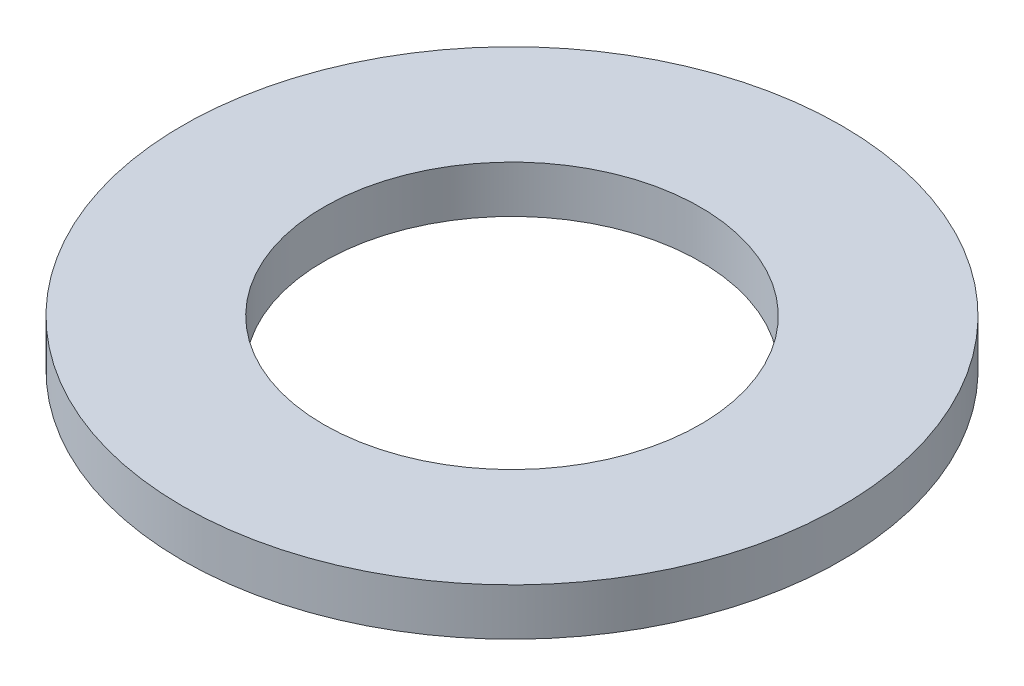
ISO-10303-21;
HEADER;
FILE_DESCRIPTION(('STEP AP214'),'2;1');
FILE_NAME('part.step','',(''),(''),'','','');
FILE_SCHEMA(('AUTOMOTIVE_DESIGN { 1 0 10303 214 1 1 1 1 }'));
ENDSEC;
DATA;
#1=APPLICATION_CONTEXT('core data for automotive mechanical design processes');
#2=APPLICATION_PROTOCOL_DEFINITION('international standard','automotive_design',2000,#1);
#3=PRODUCT_CONTEXT('',#1,'mechanical');
#4=PRODUCT('Part','Part','',(#3));
#5=PRODUCT_RELATED_PRODUCT_CATEGORY('part','',(#4));
#6=PRODUCT_DEFINITION_FORMATION('','',#4);
#7=PRODUCT_DEFINITION_CONTEXT('part definition',#1,'design');
#8=PRODUCT_DEFINITION('design','',#6,#7);
#9=PRODUCT_DEFINITION_SHAPE('','',#8);
#10=(LENGTH_UNIT() NAMED_UNIT(*) SI_UNIT(.MILLI.,.METRE.));
#11=(NAMED_UNIT(*) PLANE_ANGLE_UNIT() SI_UNIT($,.RADIAN.));
#12=(NAMED_UNIT(*) SI_UNIT($,.STERADIAN.) SOLID_ANGLE_UNIT());
#13=UNCERTAINTY_MEASURE_WITH_UNIT(LENGTH_MEASURE(1.E-05),#10,'distance_accuracy_value','');
#14=(GEOMETRIC_REPRESENTATION_CONTEXT(3) GLOBAL_UNCERTAINTY_ASSIGNED_CONTEXT((#13)) GLOBAL_UNIT_ASSIGNED_CONTEXT((#10,
#11,#12)) REPRESENTATION_CONTEXT('',''));
#15=CARTESIAN_POINT('',(0.,0.,0.));
#16=DIRECTION('',(0.,0.,1.));
#17=DIRECTION('',(1.,0.,0.));
#18=AXIS2_PLACEMENT_3D('',#15,#16,#17);
#19=CARTESIAN_POINT('',(0.,1.,0.));
#20=DIRECTION('',(0.,-1.,0.));
#21=DIRECTION('',(0.,0.,-1.));
#22=AXIS2_PLACEMENT_3D('',#19,#20,#21);
#23=CYLINDRICAL_SURFACE('',#22,7.);
#24=CARTESIAN_POINT('',(0.,1.,0.));
#25=DIRECTION('',(0.,1.,0.));
#26=DIRECTION('',(0.,0.,1.));
#27=AXIS2_PLACEMENT_3D('',#24,#25,#26);
#28=CIRCLE('',#27,7.);
#29=CARTESIAN_POINT('',(0.,1.,7.));
#30=VERTEX_POINT('',#29);
#31=EDGE_CURVE('E10',#30,#30,#28,.T.);
#32=ORIENTED_EDGE('',*,*,#31,.F.);
#33=EDGE_LOOP('',(#32));
#34=FACE_BOUND('',#33,.T.);
#35=CARTESIAN_POINT('',(0.,0.,0.));
#36=DIRECTION('',(0.,1.,0.));
#37=DIRECTION('',(0.,0.,1.));
#38=AXIS2_PLACEMENT_3D('',#35,#36,#37);
#39=CIRCLE('',#38,7.);
#40=CARTESIAN_POINT('',(0.,0.,7.));
#41=VERTEX_POINT('',#40);
#42=EDGE_CURVE('E35',#41,#41,#39,.T.);
#43=ORIENTED_EDGE('',*,*,#42,.T.);
#44=EDGE_LOOP('',(#43));
#45=FACE_BOUND('',#44,.T.);
#46=ADVANCED_FACE('F32',(#34,#45),#23,.T.);
#47=CARTESIAN_POINT('',(0.,1.,0.));
#48=DIRECTION('',(0.,1.,0.));
#49=DIRECTION('',(0.,0.,1.));
#50=AXIS2_PLACEMENT_3D('',#47,#48,#49);
#51=PLANE('',#50);
#52=CARTESIAN_POINT('',(0.,1.,0.));
#53=DIRECTION('',(0.,1.,0.));
#54=DIRECTION('',(0.,0.,1.));
#55=AXIS2_PLACEMENT_3D('',#52,#53,#54);
#56=CIRCLE('',#55,4.);
#57=CARTESIAN_POINT('',(0.,1.,4.));
#58=VERTEX_POINT('',#57);
#59=EDGE_CURVE('E44',#58,#58,#56,.T.);
#60=ORIENTED_EDGE('',*,*,#59,.F.);
#61=EDGE_LOOP('',(#60));
#62=FACE_BOUND('',#61,.T.);
#63=ORIENTED_EDGE('',*,*,#31,.T.);
#64=EDGE_LOOP('',(#63));
#65=FACE_BOUND('',#64,.T.);
#66=ADVANCED_FACE('F59',(#62,#65),#51,.T.);
#67=CARTESIAN_POINT('',(0.,0.,0.));
#68=DIRECTION('',(0.,1.,0.));
#69=DIRECTION('',(0.,0.,1.));
#70=AXIS2_PLACEMENT_3D('',#67,#68,#69);
#71=PLANE('',#70);
#72=CARTESIAN_POINT('',(0.,0.,0.));
#73=DIRECTION('',(0.,1.,0.));
#74=DIRECTION('',(0.,0.,1.));
#75=AXIS2_PLACEMENT_3D('',#72,#73,#74);
#76=CIRCLE('',#75,4.);
#77=CARTESIAN_POINT('',(0.,0.,4.));
#78=VERTEX_POINT('',#77);
#79=EDGE_CURVE('E42',#78,#78,#76,.T.);
#80=ORIENTED_EDGE('',*,*,#79,.T.);
#81=EDGE_LOOP('',(#80));
#82=FACE_BOUND('',#81,.T.);
#83=ORIENTED_EDGE('',*,*,#42,.F.);
#84=EDGE_LOOP('',(#83));
#85=FACE_BOUND('',#84,.T.);
#86=ADVANCED_FACE('F50',(#82,#85),#71,.F.);
#87=CARTESIAN_POINT('',(0.,0.,0.));
#88=DIRECTION('',(0.,1.,0.));
#89=DIRECTION('',(0.,0.,1.));
#90=AXIS2_PLACEMENT_3D('',#87,#88,#89);
#91=CYLINDRICAL_SURFACE('',#90,4.);
#92=ORIENTED_EDGE('',*,*,#79,.F.);
#93=EDGE_LOOP('',(#92));
#94=FACE_BOUND('',#93,.T.);
#95=ORIENTED_EDGE('',*,*,#59,.T.);
#96=EDGE_LOOP('',(#95));
#97=FACE_BOUND('',#96,.T.);
#98=ADVANCED_FACE('F53',(#94,#97),#91,.F.);
#99=CLOSED_SHELL('',(#46,#66,#86,#98));
#100=MANIFOLD_SOLID_BREP('B2',#99);
#101=ADVANCED_BREP_SHAPE_REPRESENTATION('',(#18,#100),#14);
#102=SHAPE_DEFINITION_REPRESENTATION(#9,#101);
ENDSEC;
END-ISO-10303-21;
